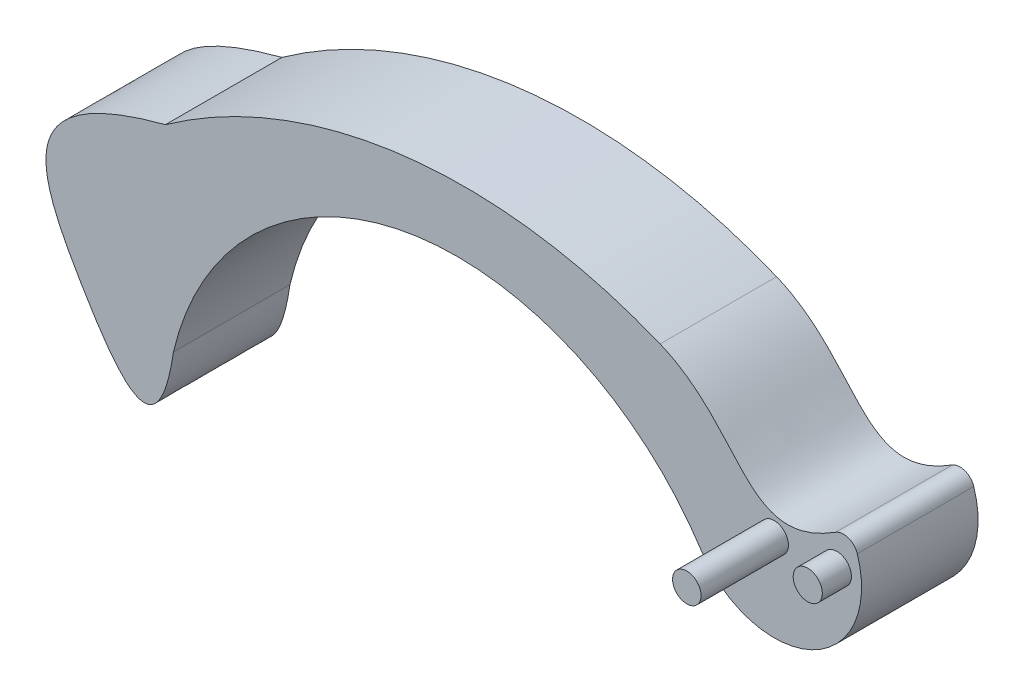
ISO-10303-21;
HEADER;
FILE_DESCRIPTION(('STEP AP214'),'2;1');
FILE_NAME('part.step','',(''),(''),'','','');
FILE_SCHEMA(('AUTOMOTIVE_DESIGN { 1 0 10303 214 1 1 1 1 }'));
ENDSEC;
DATA;
#1=APPLICATION_CONTEXT('core data for automotive mechanical design processes');
#2=APPLICATION_PROTOCOL_DEFINITION('international standard','automotive_design',2000,#1);
#3=PRODUCT_CONTEXT('',#1,'mechanical');
#4=PRODUCT('Part','Part','',(#3));
#5=PRODUCT_RELATED_PRODUCT_CATEGORY('part','',(#4));
#6=PRODUCT_DEFINITION_FORMATION('','',#4);
#7=PRODUCT_DEFINITION_CONTEXT('part definition',#1,'design');
#8=PRODUCT_DEFINITION('design','',#6,#7);
#9=PRODUCT_DEFINITION_SHAPE('','',#8);
#10=(LENGTH_UNIT() NAMED_UNIT(*) SI_UNIT(.MILLI.,.METRE.));
#11=(NAMED_UNIT(*) PLANE_ANGLE_UNIT() SI_UNIT($,.RADIAN.));
#12=(NAMED_UNIT(*) SI_UNIT($,.STERADIAN.) SOLID_ANGLE_UNIT());
#13=UNCERTAINTY_MEASURE_WITH_UNIT(LENGTH_MEASURE(1.E-05),#10,'distance_accuracy_value','');
#14=(GEOMETRIC_REPRESENTATION_CONTEXT(3) GLOBAL_UNCERTAINTY_ASSIGNED_CONTEXT((#13)) GLOBAL_UNIT_ASSIGNED_CONTEXT((#10,
#11,#12)) REPRESENTATION_CONTEXT('',''));
#15=CARTESIAN_POINT('',(0.,0.,0.));
#16=DIRECTION('',(0.,0.,1.));
#17=DIRECTION('',(1.,0.,0.));
#18=AXIS2_PLACEMENT_3D('',#15,#16,#17);
#19=CARTESIAN_POINT('',(5.29892423301703,15.2100608801611,40.));
#20=CARTESIAN_POINT('',(-30.4124170871047,-10.9230430583758,40.));
#21=CARTESIAN_POINT('',(-29.6710880162714,25.482582403556,40.));
#22=CARTESIAN_POINT('',(-59.7325894887888,37.8115004463702,40.));
#23=B_SPLINE_CURVE_WITH_KNOTS('',3,(#19,#20,#21,#22),.UNSPECIFIED.,.F.,.F.,(4,4),(0.,1.),.UNSPECIFIED.);
#24=DIRECTION('',(0.,0.,-1.));
#25=VECTOR('',#24,1.);
#26=SURFACE_OF_LINEAR_EXTRUSION('',#23,#25);
#27=CARTESIAN_POINT('',(0.545986045735249,11.9608868278957,40.));
#28=VERTEX_POINT('',#27);
#29=CARTESIAN_POINT('',(-59.7325894887888,37.8115004463702,40.));
#30=VERTEX_POINT('',#29);
#31=EDGE_CURVE('E93',#28,#30,#23,.T.);
#32=ORIENTED_EDGE('',*,*,#31,.F.);
#33=DIRECTION('',(0.,0.,-1.));
#34=VECTOR('',#33,1.);
#35=CARTESIAN_POINT('',(0.545986045735249,11.9608868278957,40.));
#36=LINE('',#35,#34);
#37=CARTESIAN_POINT('',(0.545986045735249,11.9608868278957,0.));
#38=VERTEX_POINT('',#37);
#39=EDGE_CURVE('E116',#28,#38,#36,.T.);
#40=ORIENTED_EDGE('',*,*,#39,.T.);
#41=CARTESIAN_POINT('',(5.29892423301703,15.2100608801611,0.));
#42=CARTESIAN_POINT('',(-30.4124170871047,-10.9230430583758,0.));
#43=CARTESIAN_POINT('',(-29.6710880162714,25.482582403556,0.));
#44=CARTESIAN_POINT('',(-59.7325894887888,37.8115004463702,0.));
#45=B_SPLINE_CURVE_WITH_KNOTS('',3,(#41,#42,#43,#44),.UNSPECIFIED.,.F.,.F.,(4,4),(0.,1.),.UNSPECIFIED.);
#46=CARTESIAN_POINT('',(-59.7325894887888,37.8115004463702,0.));
#47=VERTEX_POINT('',#46);
#48=EDGE_CURVE('E114',#38,#47,#45,.T.);
#49=ORIENTED_EDGE('',*,*,#48,.T.);
#50=DIRECTION('',(0.,0.,-1.));
#51=VECTOR('',#50,1.);
#52=CARTESIAN_POINT('',(-59.7325894887888,37.8115004463702,40.));
#53=LINE('',#52,#51);
#54=EDGE_CURVE('E108',#30,#47,#53,.T.);
#55=ORIENTED_EDGE('',*,*,#54,.F.);
#56=EDGE_LOOP('',(#32,#40,#49,#55));
#57=FACE_BOUND('',#56,.T.);
#58=ADVANCED_FACE('F41',(#57),#26,.F.);
#59=CARTESIAN_POINT('',(-126.804052297434,-125.728306614085,40.));
#60=DIRECTION('',(0.,0.,-1.));
#61=DIRECTION('',(-1.,0.,0.));
#62=AXIS2_PLACEMENT_3D('',#59,#60,#61);
#63=CYLINDRICAL_SURFACE('',#62,176.759298529561);
#64=CARTESIAN_POINT('',(-126.804052297434,-125.728306614085,0.));
#65=DIRECTION('',(0.,0.,1.));
#66=DIRECTION('',(1.,0.,0.));
#67=AXIS2_PLACEMENT_3D('',#64,#65,#66);
#68=CIRCLE('',#67,176.759298529561);
#69=CARTESIAN_POINT('',(-229.546733983355,18.1042035379946,0.));
#70=VERTEX_POINT('',#69);
#71=EDGE_CURVE('E136',#47,#70,#68,.T.);
#72=ORIENTED_EDGE('',*,*,#71,.T.);
#73=DIRECTION('',(0.,0.,-1.));
#74=VECTOR('',#73,1.);
#75=CARTESIAN_POINT('',(-229.546733983355,18.1042035379946,40.));
#76=LINE('',#75,#74);
#77=CARTESIAN_POINT('',(-229.546733983355,18.1042035379946,40.));
#78=VERTEX_POINT('',#77);
#79=EDGE_CURVE('E110',#78,#70,#76,.T.);
#80=ORIENTED_EDGE('',*,*,#79,.F.);
#81=CARTESIAN_POINT('',(-126.804052297434,-125.728306614085,40.));
#82=DIRECTION('',(0.,0.,1.));
#83=DIRECTION('',(1.,0.,0.));
#84=AXIS2_PLACEMENT_3D('',#81,#82,#83);
#85=CIRCLE('',#84,176.759298529561);
#86=EDGE_CURVE('E96',#30,#78,#85,.T.);
#87=ORIENTED_EDGE('',*,*,#86,.F.);
#88=ORIENTED_EDGE('',*,*,#54,.T.);
#89=EDGE_LOOP('',(#72,#80,#87,#88));
#90=FACE_BOUND('',#89,.T.);
#91=ADVANCED_FACE('F107',(#90),#63,.T.);
#92=CARTESIAN_POINT('',(-229.546733983355,18.1042035379946,40.));
#93=CARTESIAN_POINT('',(-283.009548958926,4.04474530899976,40.));
#94=CARTESIAN_POINT('',(-269.798080996907,-29.1391921754049,40.));
#95=CARTESIAN_POINT('',(-232.17114858798,-84.6853165912197,40.));
#96=CARTESIAN_POINT('',(-226.811353190655,-48.1279049253178,40.));
#97=B_SPLINE_CURVE_WITH_KNOTS('',3,(#92,#93,#94,#95,#96),.UNSPECIFIED.,.F.,.F.,(4,1,4),(0.,
0.619131086252763,1.),.UNSPECIFIED.);
#98=DIRECTION('',(0.,0.,-1.));
#99=VECTOR('',#98,1.);
#100=SURFACE_OF_LINEAR_EXTRUSION('',#97,#99);
#101=CARTESIAN_POINT('',(-229.546733983355,18.1042035379946,0.));
#102=CARTESIAN_POINT('',(-283.009548958926,4.04474530899976,0.));
#103=CARTESIAN_POINT('',(-269.798080996907,-29.1391921754049,0.));
#104=CARTESIAN_POINT('',(-232.17114858798,-84.6853165912197,0.));
#105=CARTESIAN_POINT('',(-226.811353190655,-48.1279049253178,0.));
#106=B_SPLINE_CURVE_WITH_KNOTS('',3,(#101,#102,#103,#104,#105),.UNSPECIFIED.,.F.,.F.,(4,1,4),
(0.,0.619131086252763,1.),.UNSPECIFIED.);
#107=CARTESIAN_POINT('',(-226.811353190655,-48.1279049253178,0.));
#108=VERTEX_POINT('',#107);
#109=EDGE_CURVE('E132',#70,#108,#106,.T.);
#110=ORIENTED_EDGE('',*,*,#109,.T.);
#111=DIRECTION('',(0.,0.,-1.));
#112=VECTOR('',#111,1.);
#113=CARTESIAN_POINT('',(-226.811353190655,-48.1279049253178,40.));
#114=LINE('',#113,#112);
#115=CARTESIAN_POINT('',(-226.811353190655,-48.1279049253178,40.));
#116=VERTEX_POINT('',#115);
#117=EDGE_CURVE('E119',#116,#108,#114,.T.);
#118=ORIENTED_EDGE('',*,*,#117,.F.);
#119=EDGE_CURVE('E112',#78,#116,#97,.T.);
#120=ORIENTED_EDGE('',*,*,#119,.F.);
#121=ORIENTED_EDGE('',*,*,#79,.T.);
#122=EDGE_LOOP('',(#110,#118,#120,#121));
#123=FACE_BOUND('',#122,.T.);
#124=ADVANCED_FACE('F158',(#123),#100,.F.);
#125=CARTESIAN_POINT('',(-129.461260484024,-70.9962115965675,40.));
#126=DIRECTION('',(0.,0.,-1.));
#127=DIRECTION('',(-1.,0.,0.));
#128=AXIS2_PLACEMENT_3D('',#125,#126,#127);
#129=CYLINDRICAL_SURFACE('',#128,100.);
#130=CARTESIAN_POINT('',(-129.461260484024,-70.9962115965675,0.));
#131=DIRECTION('',(0.,0.,-1.));
#132=DIRECTION('',(1.,0.,0.));
#133=AXIS2_PLACEMENT_3D('',#130,#131,#132);
#134=CIRCLE('',#133,100.);
#135=CARTESIAN_POINT('',(-45.6882421755463,-16.3877744875687,0.));
#136=VERTEX_POINT('',#135);
#137=EDGE_CURVE('E130',#108,#136,#134,.T.);
#138=ORIENTED_EDGE('',*,*,#137,.T.);
#139=DIRECTION('',(0.,0.,-1.));
#140=VECTOR('',#139,1.);
#141=CARTESIAN_POINT('',(-45.6882421755463,-16.3877744875687,40.));
#142=LINE('',#141,#140);
#143=CARTESIAN_POINT('',(-45.6882421755463,-16.3877744875687,40.));
#144=VERTEX_POINT('',#143);
#145=EDGE_CURVE('E125',#144,#136,#142,.T.);
#146=ORIENTED_EDGE('',*,*,#145,.F.);
#147=CARTESIAN_POINT('',(-129.461260484024,-70.9962115965675,40.));
#148=DIRECTION('',(0.,0.,-1.));
#149=DIRECTION('',(1.,0.,0.));
#150=AXIS2_PLACEMENT_3D('',#147,#148,#149);
#151=CIRCLE('',#150,100.);
#152=EDGE_CURVE('E149',#116,#144,#151,.T.);
#153=ORIENTED_EDGE('',*,*,#152,.F.);
#154=ORIENTED_EDGE('',*,*,#117,.T.);
#155=EDGE_LOOP('',(#138,#146,#153,#154));
#156=FACE_BOUND('',#155,.T.);
#157=ADVANCED_FACE('F162',(#156),#129,.F.);
#158=CARTESIAN_POINT('',(-20.556336683003,-0.00524335486909791,40.));
#159=DIRECTION('',(0.,0.,-1.));
#160=DIRECTION('',(-1.,0.,0.));
#161=AXIS2_PLACEMENT_3D('',#158,#159,#160);
#162=CYLINDRICAL_SURFACE('',#161,30.);
#163=CARTESIAN_POINT('',(-20.556336683003,-0.00524335486909791,0.));
#164=DIRECTION('',(0.,0.,1.));
#165=DIRECTION('',(-1.,0.,0.));
#166=AXIS2_PLACEMENT_3D('',#163,#164,#165);
#167=CIRCLE('',#166,30.);
#168=CARTESIAN_POINT('',(7.97022184463306,9.28106153832465,0.));
#169=VERTEX_POINT('',#168);
#170=EDGE_CURVE('E103',#136,#169,#167,.T.);
#171=ORIENTED_EDGE('',*,*,#170,.T.);
#172=DIRECTION('',(0.,0.,-1.));
#173=VECTOR('',#172,1.);
#174=CARTESIAN_POINT('',(7.97022184463306,9.28106153832465,40.));
#175=LINE('',#174,#173);
#176=CARTESIAN_POINT('',(7.97022184463306,9.28106153832465,40.));
#177=VERTEX_POINT('',#176);
#178=EDGE_CURVE('E49',#169,#177,#175,.F.);
#179=ORIENTED_EDGE('',*,*,#178,.T.);
#180=CARTESIAN_POINT('',(-20.556336683003,-0.00524335486909791,40.));
#181=DIRECTION('',(0.,0.,1.));
#182=DIRECTION('',(-1.,0.,0.));
#183=AXIS2_PLACEMENT_3D('',#180,#181,#182);
#184=CIRCLE('',#183,30.);
#185=EDGE_CURVE('E128',#144,#177,#184,.T.);
#186=ORIENTED_EDGE('',*,*,#185,.F.);
#187=ORIENTED_EDGE('',*,*,#145,.T.);
#188=EDGE_LOOP('',(#171,#179,#186,#187));
#189=FACE_BOUND('',#188,.T.);
#190=ADVANCED_FACE('F198',(#189),#162,.T.);
#191=CARTESIAN_POINT('',(-29.3355225707375,12.087522420259,40.));
#192=DIRECTION('',(0.,0.,1.));
#193=DIRECTION('',(1.,0.,0.));
#194=AXIS2_PLACEMENT_3D('',#191,#192,#193);
#195=PLANE('',#194);
#196=CARTESIAN_POINT('',(-20.556336683003,-0.00524335486909791,40.));
#197=DIRECTION('',(0.,0.,1.));
#198=DIRECTION('',(1.,0.,0.));
#199=AXIS2_PLACEMENT_3D('',#196,#197,#198);
#200=CIRCLE('',#199,4.89535423487748);
#201=CARTESIAN_POINT('',(-15.6609824481255,-0.00524335486909791,40.));
#202=VERTEX_POINT('',#201);
#203=EDGE_CURVE('E180',#202,#202,#200,.T.);
#204=ORIENTED_EDGE('',*,*,#203,.F.);
#205=EDGE_LOOP('',(#204));
#206=FACE_BOUND('',#205,.T.);
#207=CARTESIAN_POINT('',(0.966678816916371,1.49831668140828,40.));
#208=DIRECTION('',(0.,0.,1.));
#209=DIRECTION('',(1.,0.,0.));
#210=AXIS2_PLACEMENT_3D('',#207,#208,#209);
#211=CIRCLE('',#210,5.);
#212=CARTESIAN_POINT('',(5.96667881691637,1.49831668140828,40.));
#213=VERTEX_POINT('',#212);
#214=EDGE_CURVE('E171',#213,#213,#211,.T.);
#215=ORIENTED_EDGE('',*,*,#214,.F.);
#216=EDGE_LOOP('',(#215));
#217=FACE_BOUND('',#216,.T.);
#218=ORIENTED_EDGE('',*,*,#185,.T.);
#219=CARTESIAN_POINT('',(3.21579542336041,7.7333440561257,40.));
#220=DIRECTION('',(0.,0.,1.));
#221=DIRECTION('',(1.,0.,0.));
#222=AXIS2_PLACEMENT_3D('',#219,#220,#221);
#223=CIRCLE('',#222,5.);
#224=EDGE_CURVE('E11',#177,#28,#223,.T.);
#225=ORIENTED_EDGE('',*,*,#224,.T.);
#226=ORIENTED_EDGE('',*,*,#31,.T.);
#227=ORIENTED_EDGE('',*,*,#86,.T.);
#228=ORIENTED_EDGE('',*,*,#119,.T.);
#229=ORIENTED_EDGE('',*,*,#152,.T.);
#230=EDGE_LOOP('',(#218,#225,#226,#227,#228,#229));
#231=FACE_BOUND('',#230,.T.);
#232=ADVANCED_FACE('F95',(#206,#217,#231),#195,.T.);
#233=CARTESIAN_POINT('',(-29.3355225707375,12.087522420259,0.));
#234=DIRECTION('',(0.,0.,1.));
#235=DIRECTION('',(1.,0.,0.));
#236=AXIS2_PLACEMENT_3D('',#233,#234,#235);
#237=PLANE('',#236);
#238=ORIENTED_EDGE('',*,*,#48,.F.);
#239=CARTESIAN_POINT('',(3.21579542336041,7.7333440561257,0.));
#240=DIRECTION('',(0.,0.,1.));
#241=DIRECTION('',(1.,0.,0.));
#242=AXIS2_PLACEMENT_3D('',#239,#240,#241);
#243=CIRCLE('',#242,5.);
#244=EDGE_CURVE('E63',#38,#169,#243,.F.);
#245=ORIENTED_EDGE('',*,*,#244,.T.);
#246=ORIENTED_EDGE('',*,*,#170,.F.);
#247=ORIENTED_EDGE('',*,*,#137,.F.);
#248=ORIENTED_EDGE('',*,*,#109,.F.);
#249=ORIENTED_EDGE('',*,*,#71,.F.);
#250=EDGE_LOOP('',(#238,#245,#246,#247,#248,#249));
#251=FACE_BOUND('',#250,.T.);
#252=ADVANCED_FACE('F197',(#251),#237,.F.);
#253=CARTESIAN_POINT('',(3.21579542336041,7.7333440561257,20.));
#254=DIRECTION('',(0.,0.,-1.));
#255=DIRECTION('',(-1.,0.,0.));
#256=AXIS2_PLACEMENT_3D('',#253,#254,#255);
#257=CYLINDRICAL_SURFACE('',#256,5.);
#258=ORIENTED_EDGE('',*,*,#224,.F.);
#259=ORIENTED_EDGE('',*,*,#178,.F.);
#260=ORIENTED_EDGE('',*,*,#244,.F.);
#261=ORIENTED_EDGE('',*,*,#39,.F.);
#262=EDGE_LOOP('',(#258,#259,#260,#261));
#263=FACE_BOUND('',#262,.T.);
#264=ADVANCED_FACE('F43',(#263),#257,.T.);
#265=CARTESIAN_POINT('',(0.966678816916371,1.49831668140828,50.));
#266=DIRECTION('',(0.,0.,-1.));
#267=DIRECTION('',(-1.,0.,0.));
#268=AXIS2_PLACEMENT_3D('',#265,#266,#267);
#269=CYLINDRICAL_SURFACE('',#268,5.);
#270=CARTESIAN_POINT('',(0.966678816916371,1.49831668140828,50.));
#271=DIRECTION('',(0.,0.,1.));
#272=DIRECTION('',(1.,0.,0.));
#273=AXIS2_PLACEMENT_3D('',#270,#271,#272);
#274=CIRCLE('',#273,5.);
#275=CARTESIAN_POINT('',(5.96667881691637,1.49831668140828,50.));
#276=VERTEX_POINT('',#275);
#277=EDGE_CURVE('E144',#276,#276,#274,.T.);
#278=ORIENTED_EDGE('',*,*,#277,.F.);
#279=EDGE_LOOP('',(#278));
#280=FACE_BOUND('',#279,.T.);
#281=ORIENTED_EDGE('',*,*,#214,.T.);
#282=EDGE_LOOP('',(#281));
#283=FACE_BOUND('',#282,.T.);
#284=ADVANCED_FACE('F202',(#280,#283),#269,.T.);
#285=CARTESIAN_POINT('',(0.966678816916371,1.49831668140828,50.));
#286=DIRECTION('',(0.,0.,1.));
#287=DIRECTION('',(1.,0.,0.));
#288=AXIS2_PLACEMENT_3D('',#285,#286,#287);
#289=PLANE('',#288);
#290=ORIENTED_EDGE('',*,*,#277,.T.);
#291=EDGE_LOOP('',(#290));
#292=FACE_BOUND('',#291,.T.);
#293=ADVANCED_FACE('F191',(#292),#289,.T.);
#294=CARTESIAN_POINT('',(-20.556336683003,-0.00524335486909791,70.));
#295=DIRECTION('',(0.,0.,-1.));
#296=DIRECTION('',(-1.,0.,0.));
#297=AXIS2_PLACEMENT_3D('',#294,#295,#296);
#298=CYLINDRICAL_SURFACE('',#297,4.89535423487748);
#299=CARTESIAN_POINT('',(-20.556336683003,-0.00524335486909791,70.));
#300=DIRECTION('',(0.,0.,1.));
#301=DIRECTION('',(1.,0.,0.));
#302=AXIS2_PLACEMENT_3D('',#299,#300,#301);
#303=CIRCLE('',#302,4.89535423487748);
#304=CARTESIAN_POINT('',(-15.6609824481255,-0.00524335486909791,70.));
#305=VERTEX_POINT('',#304);
#306=EDGE_CURVE('E177',#305,#305,#303,.T.);
#307=ORIENTED_EDGE('',*,*,#306,.F.);
#308=EDGE_LOOP('',(#307));
#309=FACE_BOUND('',#308,.T.);
#310=ORIENTED_EDGE('',*,*,#203,.T.);
#311=EDGE_LOOP('',(#310));
#312=FACE_BOUND('',#311,.T.);
#313=ADVANCED_FACE('F188',(#309,#312),#298,.T.);
#314=CARTESIAN_POINT('',(-20.556336683003,-0.00524335486909791,70.));
#315=DIRECTION('',(0.,0.,1.));
#316=DIRECTION('',(1.,0.,0.));
#317=AXIS2_PLACEMENT_3D('',#314,#315,#316);
#318=PLANE('',#317);
#319=ORIENTED_EDGE('',*,*,#306,.T.);
#320=EDGE_LOOP('',(#319));
#321=FACE_BOUND('',#320,.T.);
#322=ADVANCED_FACE('F186',(#321),#318,.T.);
#323=CLOSED_SHELL('',(#58,#91,#124,#157,#190,#232,#252,#264,#284,#293,#313,#322));
#324=MANIFOLD_SOLID_BREP('B2',#323);
#325=ADVANCED_BREP_SHAPE_REPRESENTATION('',(#18,#324),#14);
#326=SHAPE_DEFINITION_REPRESENTATION(#9,#325);
ENDSEC;
END-ISO-10303-21;
